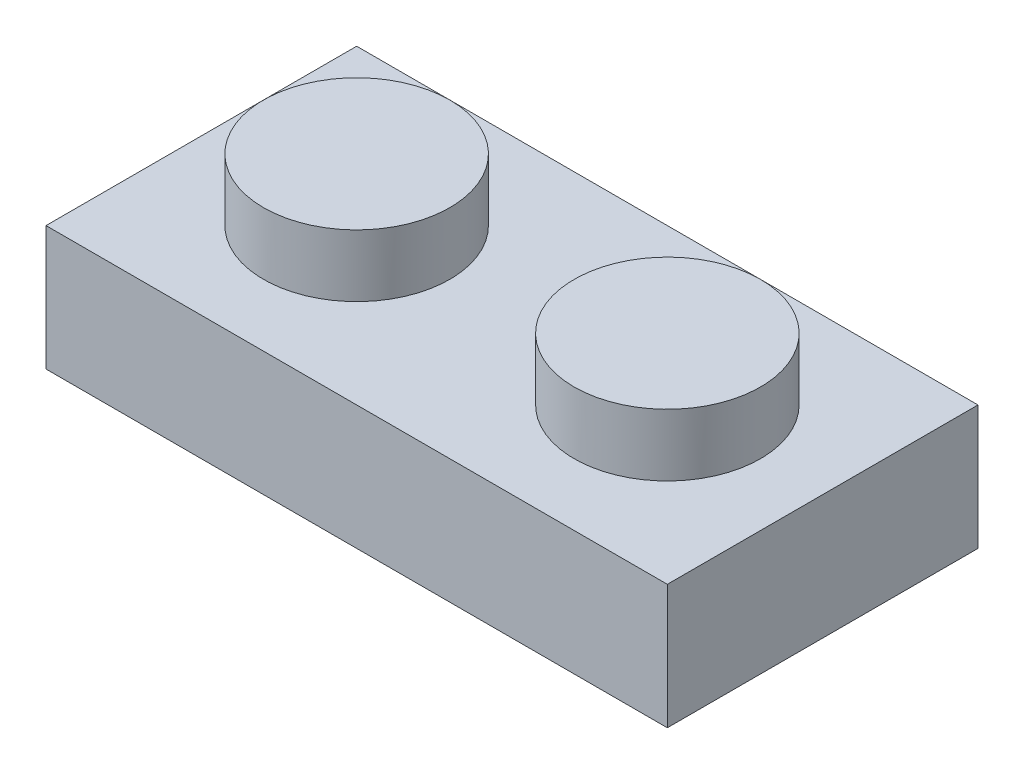
ISO-10303-21;
HEADER;
FILE_DESCRIPTION(('STEP AP214'),'2;1');
FILE_NAME('part.step','',(''),(''),'','','');
FILE_SCHEMA(('AUTOMOTIVE_DESIGN { 1 0 10303 214 1 1 1 1 }'));
ENDSEC;
DATA;
#1=APPLICATION_CONTEXT('core data for automotive mechanical design processes');
#2=APPLICATION_PROTOCOL_DEFINITION('international standard','automotive_design',2000,#1);
#3=PRODUCT_CONTEXT('',#1,'mechanical');
#4=PRODUCT('Part','Part','',(#3));
#5=PRODUCT_RELATED_PRODUCT_CATEGORY('part','',(#4));
#6=PRODUCT_DEFINITION_FORMATION('','',#4);
#7=PRODUCT_DEFINITION_CONTEXT('part definition',#1,'design');
#8=PRODUCT_DEFINITION('design','',#6,#7);
#9=PRODUCT_DEFINITION_SHAPE('','',#8);
#10=(LENGTH_UNIT() NAMED_UNIT(*) SI_UNIT(.MILLI.,.METRE.));
#11=(NAMED_UNIT(*) PLANE_ANGLE_UNIT() SI_UNIT($,.RADIAN.));
#12=(NAMED_UNIT(*) SI_UNIT($,.STERADIAN.) SOLID_ANGLE_UNIT());
#13=UNCERTAINTY_MEASURE_WITH_UNIT(LENGTH_MEASURE(1.E-05),#10,'distance_accuracy_value','');
#14=(GEOMETRIC_REPRESENTATION_CONTEXT(3) GLOBAL_UNCERTAINTY_ASSIGNED_CONTEXT((#13)) GLOBAL_UNIT_ASSIGNED_CONTEXT((#10,
#11,#12)) REPRESENTATION_CONTEXT('',''));
#15=CARTESIAN_POINT('',(0.,0.,0.));
#16=DIRECTION('',(0.,0.,1.));
#17=DIRECTION('',(1.,0.,0.));
#18=AXIS2_PLACEMENT_3D('',#15,#16,#17);
#19=CARTESIAN_POINT('',(0.,0.,0.));
#20=DIRECTION('',(0.,-1.,0.));
#21=DIRECTION('',(0.,0.,-1.));
#22=AXIS2_PLACEMENT_3D('',#19,#20,#21);
#23=PLANE('',#22);
#24=DIRECTION('',(0.,0.,1.));
#25=VECTOR('',#24,1.);
#26=CARTESIAN_POINT('',(0.,0.,0.));
#27=LINE('',#26,#25);
#28=CARTESIAN_POINT('',(0.,0.,-8.));
#29=VERTEX_POINT('',#28);
#30=CARTESIAN_POINT('',(0.,0.,0.));
#31=VERTEX_POINT('',#30);
#32=EDGE_CURVE('E190',#29,#31,#27,.T.);
#33=ORIENTED_EDGE('',*,*,#32,.F.);
#34=DIRECTION('',(-1.,0.,0.));
#35=VECTOR('',#34,1.);
#36=CARTESIAN_POINT('',(0.,0.,-8.));
#37=LINE('',#36,#35);
#38=CARTESIAN_POINT('',(16.,0.,-8.));
#39=VERTEX_POINT('',#38);
#40=EDGE_CURVE('E85',#39,#29,#37,.T.);
#41=ORIENTED_EDGE('',*,*,#40,.F.);
#42=DIRECTION('',(0.,0.,-1.));
#43=VECTOR('',#42,1.);
#44=CARTESIAN_POINT('',(16.,0.,0.));
#45=LINE('',#44,#43);
#46=CARTESIAN_POINT('',(16.,0.,0.));
#47=VERTEX_POINT('',#46);
#48=EDGE_CURVE('E208',#47,#39,#45,.T.);
#49=ORIENTED_EDGE('',*,*,#48,.F.);
#50=DIRECTION('',(1.,0.,0.));
#51=VECTOR('',#50,1.);
#52=CARTESIAN_POINT('',(0.,0.,0.));
#53=LINE('',#52,#51);
#54=EDGE_CURVE('E205',#31,#47,#53,.T.);
#55=ORIENTED_EDGE('',*,*,#54,.F.);
#56=EDGE_LOOP('',(#33,#41,#49,#55));
#57=FACE_BOUND('',#56,.T.);
#58=DIRECTION('',(-1.,0.,0.));
#59=VECTOR('',#58,1.);
#60=CARTESIAN_POINT('',(0.,0.,-6.4));
#61=LINE('',#60,#59);
#62=CARTESIAN_POINT('',(14.4,0.,-6.4));
#63=VERTEX_POINT('',#62);
#64=CARTESIAN_POINT('',(1.6,0.,-6.4));
#65=VERTEX_POINT('',#64);
#66=EDGE_CURVE('E135',#63,#65,#61,.T.);
#67=ORIENTED_EDGE('',*,*,#66,.T.);
#68=DIRECTION('',(0.,0.,1.));
#69=VECTOR('',#68,1.);
#70=CARTESIAN_POINT('',(1.6,0.,0.));
#71=LINE('',#70,#69);
#72=CARTESIAN_POINT('',(1.6,0.,-1.6));
#73=VERTEX_POINT('',#72);
#74=EDGE_CURVE('E169',#65,#73,#71,.T.);
#75=ORIENTED_EDGE('',*,*,#74,.T.);
#76=DIRECTION('',(1.,0.,0.));
#77=VECTOR('',#76,1.);
#78=CARTESIAN_POINT('',(0.,0.,-1.6));
#79=LINE('',#78,#77);
#80=CARTESIAN_POINT('',(14.4,0.,-1.6));
#81=VERTEX_POINT('',#80);
#82=EDGE_CURVE('E139',#73,#81,#79,.T.);
#83=ORIENTED_EDGE('',*,*,#82,.T.);
#84=DIRECTION('',(0.,0.,-1.));
#85=VECTOR('',#84,1.);
#86=CARTESIAN_POINT('',(14.4,0.,0.));
#87=LINE('',#86,#85);
#88=EDGE_CURVE('E55',#81,#63,#87,.T.);
#89=ORIENTED_EDGE('',*,*,#88,.T.);
#90=EDGE_LOOP('',(#67,#75,#83,#89));
#91=FACE_BOUND('',#90,.T.);
#92=ADVANCED_FACE('F39',(#57,#91),#23,.T.);
#93=CARTESIAN_POINT('',(0.,3.2,0.));
#94=DIRECTION('',(1.,0.,0.));
#95=DIRECTION('',(0.,0.,-1.));
#96=AXIS2_PLACEMENT_3D('',#93,#94,#95);
#97=PLANE('',#96);
#98=ORIENTED_EDGE('',*,*,#32,.T.);
#99=DIRECTION('',(0.,-1.,0.));
#100=VECTOR('',#99,1.);
#101=CARTESIAN_POINT('',(0.,3.2,0.));
#102=LINE('',#101,#100);
#103=CARTESIAN_POINT('',(0.,3.2,0.));
#104=VERTEX_POINT('',#103);
#105=EDGE_CURVE('E222',#104,#31,#102,.T.);
#106=ORIENTED_EDGE('',*,*,#105,.F.);
#107=DIRECTION('',(0.,0.,1.));
#108=VECTOR('',#107,1.);
#109=CARTESIAN_POINT('',(0.,3.2,0.));
#110=LINE('',#109,#108);
#111=CARTESIAN_POINT('',(0.,3.2,-8.));
#112=VERTEX_POINT('',#111);
#113=EDGE_CURVE('E191',#112,#104,#110,.T.);
#114=ORIENTED_EDGE('',*,*,#113,.F.);
#115=DIRECTION('',(0.,-1.,0.));
#116=VECTOR('',#115,1.);
#117=CARTESIAN_POINT('',(0.,3.2,-8.));
#118=LINE('',#117,#116);
#119=EDGE_CURVE('E201',#112,#29,#118,.T.);
#120=ORIENTED_EDGE('',*,*,#119,.T.);
#121=EDGE_LOOP('',(#98,#106,#114,#120));
#122=FACE_BOUND('',#121,.T.);
#123=ADVANCED_FACE('F41',(#122),#97,.F.);
#124=CARTESIAN_POINT('',(0.,3.2,0.));
#125=DIRECTION('',(0.,0.,-1.));
#126=DIRECTION('',(-1.,0.,0.));
#127=AXIS2_PLACEMENT_3D('',#124,#125,#126);
#128=PLANE('',#127);
#129=ORIENTED_EDGE('',*,*,#54,.T.);
#130=DIRECTION('',(0.,-1.,0.));
#131=VECTOR('',#130,1.);
#132=CARTESIAN_POINT('',(16.,3.2,0.));
#133=LINE('',#132,#131);
#134=CARTESIAN_POINT('',(16.,3.2,0.));
#135=VERTEX_POINT('',#134);
#136=EDGE_CURVE('E218',#135,#47,#133,.T.);
#137=ORIENTED_EDGE('',*,*,#136,.F.);
#138=DIRECTION('',(1.,0.,0.));
#139=VECTOR('',#138,1.);
#140=CARTESIAN_POINT('',(0.,3.2,0.));
#141=LINE('',#140,#139);
#142=EDGE_CURVE('E93',#104,#135,#141,.T.);
#143=ORIENTED_EDGE('',*,*,#142,.F.);
#144=ORIENTED_EDGE('',*,*,#105,.T.);
#145=EDGE_LOOP('',(#129,#137,#143,#144));
#146=FACE_BOUND('',#145,.T.);
#147=ADVANCED_FACE('F239',(#146),#128,.F.);
#148=CARTESIAN_POINT('',(16.,3.2,0.));
#149=DIRECTION('',(-1.,0.,0.));
#150=DIRECTION('',(0.,0.,1.));
#151=AXIS2_PLACEMENT_3D('',#148,#149,#150);
#152=PLANE('',#151);
#153=ORIENTED_EDGE('',*,*,#48,.T.);
#154=DIRECTION('',(0.,-1.,0.));
#155=VECTOR('',#154,1.);
#156=CARTESIAN_POINT('',(16.,3.2,-8.));
#157=LINE('',#156,#155);
#158=CARTESIAN_POINT('',(16.,3.2,-8.));
#159=VERTEX_POINT('',#158);
#160=EDGE_CURVE('E215',#159,#39,#157,.T.);
#161=ORIENTED_EDGE('',*,*,#160,.F.);
#162=DIRECTION('',(0.,0.,-1.));
#163=VECTOR('',#162,1.);
#164=CARTESIAN_POINT('',(16.,3.2,0.));
#165=LINE('',#164,#163);
#166=EDGE_CURVE('E196',#135,#159,#165,.T.);
#167=ORIENTED_EDGE('',*,*,#166,.F.);
#168=ORIENTED_EDGE('',*,*,#136,.T.);
#169=EDGE_LOOP('',(#153,#161,#167,#168));
#170=FACE_BOUND('',#169,.T.);
#171=ADVANCED_FACE('F244',(#170),#152,.F.);
#172=CARTESIAN_POINT('',(0.,3.2,-8.));
#173=DIRECTION('',(0.,0.,1.));
#174=DIRECTION('',(1.,0.,0.));
#175=AXIS2_PLACEMENT_3D('',#172,#173,#174);
#176=PLANE('',#175);
#177=ORIENTED_EDGE('',*,*,#40,.T.);
#178=ORIENTED_EDGE('',*,*,#119,.F.);
#179=DIRECTION('',(-1.,0.,0.));
#180=VECTOR('',#179,1.);
#181=CARTESIAN_POINT('',(0.,3.2,-8.));
#182=LINE('',#181,#180);
#183=EDGE_CURVE('E64',#159,#112,#182,.T.);
#184=ORIENTED_EDGE('',*,*,#183,.F.);
#185=ORIENTED_EDGE('',*,*,#160,.T.);
#186=EDGE_LOOP('',(#177,#178,#184,#185));
#187=FACE_BOUND('',#186,.T.);
#188=ADVANCED_FACE('F232',(#187),#176,.F.);
#189=CARTESIAN_POINT('',(0.,3.2,0.));
#190=DIRECTION('',(0.,-1.,0.));
#191=DIRECTION('',(0.,0.,-1.));
#192=AXIS2_PLACEMENT_3D('',#189,#190,#191);
#193=PLANE('',#192);
#194=CARTESIAN_POINT('',(4.,3.2,-4.));
#195=DIRECTION('',(0.,-1.,0.));
#196=DIRECTION('',(0.,0.,-1.));
#197=AXIS2_PLACEMENT_3D('',#194,#195,#196);
#198=CIRCLE('',#197,2.4);
#199=CARTESIAN_POINT('',(4.,3.2,-6.4));
#200=VERTEX_POINT('',#199);
#201=EDGE_CURVE('E11',#200,#200,#198,.F.);
#202=ORIENTED_EDGE('',*,*,#201,.F.);
#203=EDGE_LOOP('',(#202));
#204=FACE_BOUND('',#203,.T.);
#205=CARTESIAN_POINT('',(12.,3.2,-4.));
#206=DIRECTION('',(0.,-1.,0.));
#207=DIRECTION('',(0.,0.,-1.));
#208=AXIS2_PLACEMENT_3D('',#205,#206,#207);
#209=CIRCLE('',#208,2.4);
#210=CARTESIAN_POINT('',(12.,3.2,-6.4));
#211=VERTEX_POINT('',#210);
#212=EDGE_CURVE('E48',#211,#211,#209,.F.);
#213=ORIENTED_EDGE('',*,*,#212,.F.);
#214=EDGE_LOOP('',(#213));
#215=FACE_BOUND('',#214,.T.);
#216=ORIENTED_EDGE('',*,*,#113,.T.);
#217=ORIENTED_EDGE('',*,*,#142,.T.);
#218=ORIENTED_EDGE('',*,*,#166,.T.);
#219=ORIENTED_EDGE('',*,*,#183,.T.);
#220=EDGE_LOOP('',(#216,#217,#218,#219));
#221=FACE_BOUND('',#220,.T.);
#222=ADVANCED_FACE('F230',(#204,#215,#221),#193,.F.);
#223=CARTESIAN_POINT('',(12.,4.8,-4.));
#224=DIRECTION('',(0.,-1.,0.));
#225=DIRECTION('',(0.,0.,-1.));
#226=AXIS2_PLACEMENT_3D('',#223,#224,#225);
#227=CYLINDRICAL_SURFACE('',#226,2.4);
#228=CARTESIAN_POINT('',(12.,4.8,-4.));
#229=DIRECTION('',(0.,1.,0.));
#230=DIRECTION('',(0.,0.,1.));
#231=AXIS2_PLACEMENT_3D('',#228,#229,#230);
#232=CIRCLE('',#231,2.4);
#233=CARTESIAN_POINT('',(12.,4.8,-1.6));
#234=VERTEX_POINT('',#233);
#235=EDGE_CURVE('E186',#234,#234,#232,.T.);
#236=ORIENTED_EDGE('',*,*,#235,.F.);
#237=EDGE_LOOP('',(#236));
#238=FACE_BOUND('',#237,.T.);
#239=ORIENTED_EDGE('',*,*,#212,.T.);
#240=EDGE_LOOP('',(#239));
#241=FACE_BOUND('',#240,.T.);
#242=ADVANCED_FACE('F228',(#238,#241),#227,.T.);
#243=CARTESIAN_POINT('',(12.,4.8,-4.));
#244=DIRECTION('',(0.,1.,0.));
#245=DIRECTION('',(0.,0.,1.));
#246=AXIS2_PLACEMENT_3D('',#243,#244,#245);
#247=PLANE('',#246);
#248=ORIENTED_EDGE('',*,*,#235,.T.);
#249=EDGE_LOOP('',(#248));
#250=FACE_BOUND('',#249,.T.);
#251=ADVANCED_FACE('F290',(#250),#247,.T.);
#252=CARTESIAN_POINT('',(4.,4.8,-4.));
#253=DIRECTION('',(0.,-1.,0.));
#254=DIRECTION('',(0.,0.,-1.));
#255=AXIS2_PLACEMENT_3D('',#252,#253,#254);
#256=CYLINDRICAL_SURFACE('',#255,2.4);
#257=CARTESIAN_POINT('',(4.,4.8,-4.));
#258=DIRECTION('',(0.,1.,0.));
#259=DIRECTION('',(0.,0.,1.));
#260=AXIS2_PLACEMENT_3D('',#257,#258,#259);
#261=CIRCLE('',#260,2.4);
#262=CARTESIAN_POINT('',(4.,4.8,-1.6));
#263=VERTEX_POINT('',#262);
#264=EDGE_CURVE('E163',#263,#263,#261,.T.);
#265=ORIENTED_EDGE('',*,*,#264,.F.);
#266=EDGE_LOOP('',(#265));
#267=FACE_BOUND('',#266,.T.);
#268=ORIENTED_EDGE('',*,*,#201,.T.);
#269=EDGE_LOOP('',(#268));
#270=FACE_BOUND('',#269,.T.);
#271=ADVANCED_FACE('F286',(#267,#270),#256,.T.);
#272=CARTESIAN_POINT('',(4.,4.8,-4.));
#273=DIRECTION('',(0.,1.,0.));
#274=DIRECTION('',(0.,0.,1.));
#275=AXIS2_PLACEMENT_3D('',#272,#273,#274);
#276=PLANE('',#275);
#277=ORIENTED_EDGE('',*,*,#264,.T.);
#278=EDGE_LOOP('',(#277));
#279=FACE_BOUND('',#278,.T.);
#280=ADVANCED_FACE('F283',(#279),#276,.T.);
#281=CARTESIAN_POINT('',(1.6,3.2,0.));
#282=DIRECTION('',(1.,0.,0.));
#283=DIRECTION('',(0.,0.,-1.));
#284=AXIS2_PLACEMENT_3D('',#281,#282,#283);
#285=PLANE('',#284);
#286=ORIENTED_EDGE('',*,*,#74,.F.);
#287=DIRECTION('',(0.,-1.,0.));
#288=VECTOR('',#287,1.);
#289=CARTESIAN_POINT('',(1.6,3.2,-6.4));
#290=LINE('',#289,#288);
#291=CARTESIAN_POINT('',(1.6,1.6,-6.4));
#292=VERTEX_POINT('',#291);
#293=EDGE_CURVE('E133',#292,#65,#290,.T.);
#294=ORIENTED_EDGE('',*,*,#293,.F.);
#295=DIRECTION('',(0.,0.,1.));
#296=VECTOR('',#295,1.);
#297=CARTESIAN_POINT('',(1.6,1.6,0.));
#298=LINE('',#297,#296);
#299=CARTESIAN_POINT('',(1.6,1.6,-1.6));
#300=VERTEX_POINT('',#299);
#301=EDGE_CURVE('E120',#292,#300,#298,.T.);
#302=ORIENTED_EDGE('',*,*,#301,.T.);
#303=DIRECTION('',(0.,-1.,0.));
#304=VECTOR('',#303,1.);
#305=CARTESIAN_POINT('',(1.6,3.2,-1.6));
#306=LINE('',#305,#304);
#307=EDGE_CURVE('E131',#300,#73,#306,.T.);
#308=ORIENTED_EDGE('',*,*,#307,.T.);
#309=EDGE_LOOP('',(#286,#294,#302,#308));
#310=FACE_BOUND('',#309,.T.);
#311=ADVANCED_FACE('F130',(#310),#285,.T.);
#312=CARTESIAN_POINT('',(0.,3.2,-1.6));
#313=DIRECTION('',(0.,0.,-1.));
#314=DIRECTION('',(-1.,0.,0.));
#315=AXIS2_PLACEMENT_3D('',#312,#313,#314);
#316=PLANE('',#315);
#317=ORIENTED_EDGE('',*,*,#82,.F.);
#318=ORIENTED_EDGE('',*,*,#307,.F.);
#319=DIRECTION('',(1.,0.,0.));
#320=VECTOR('',#319,1.);
#321=CARTESIAN_POINT('',(0.,1.6,-1.6));
#322=LINE('',#321,#320);
#323=CARTESIAN_POINT('',(14.4,1.6,-1.6));
#324=VERTEX_POINT('',#323);
#325=EDGE_CURVE('E116',#300,#324,#322,.T.);
#326=ORIENTED_EDGE('',*,*,#325,.T.);
#327=DIRECTION('',(0.,-1.,0.));
#328=VECTOR('',#327,1.);
#329=CARTESIAN_POINT('',(14.4,3.2,-1.6));
#330=LINE('',#329,#328);
#331=EDGE_CURVE('E142',#324,#81,#330,.T.);
#332=ORIENTED_EDGE('',*,*,#331,.T.);
#333=EDGE_LOOP('',(#317,#318,#326,#332));
#334=FACE_BOUND('',#333,.T.);
#335=ADVANCED_FACE('F137',(#334),#316,.T.);
#336=CARTESIAN_POINT('',(14.4,3.2,0.));
#337=DIRECTION('',(-1.,0.,0.));
#338=DIRECTION('',(0.,0.,1.));
#339=AXIS2_PLACEMENT_3D('',#336,#337,#338);
#340=PLANE('',#339);
#341=ORIENTED_EDGE('',*,*,#88,.F.);
#342=ORIENTED_EDGE('',*,*,#331,.F.);
#343=DIRECTION('',(0.,0.,-1.));
#344=VECTOR('',#343,1.);
#345=CARTESIAN_POINT('',(14.4,1.6,0.));
#346=LINE('',#345,#344);
#347=CARTESIAN_POINT('',(14.4,1.6,-6.4));
#348=VERTEX_POINT('',#347);
#349=EDGE_CURVE('E121',#324,#348,#346,.T.);
#350=ORIENTED_EDGE('',*,*,#349,.T.);
#351=DIRECTION('',(0.,-1.,0.));
#352=VECTOR('',#351,1.);
#353=CARTESIAN_POINT('',(14.4,3.2,-6.4));
#354=LINE('',#353,#352);
#355=EDGE_CURVE('E149',#348,#63,#354,.T.);
#356=ORIENTED_EDGE('',*,*,#355,.T.);
#357=EDGE_LOOP('',(#341,#342,#350,#356));
#358=FACE_BOUND('',#357,.T.);
#359=ADVANCED_FACE('F253',(#358),#340,.T.);
#360=CARTESIAN_POINT('',(0.,3.2,-6.4));
#361=DIRECTION('',(0.,0.,1.));
#362=DIRECTION('',(1.,0.,0.));
#363=AXIS2_PLACEMENT_3D('',#360,#361,#362);
#364=PLANE('',#363);
#365=ORIENTED_EDGE('',*,*,#66,.F.);
#366=ORIENTED_EDGE('',*,*,#355,.F.);
#367=DIRECTION('',(-1.,0.,0.));
#368=VECTOR('',#367,1.);
#369=CARTESIAN_POINT('',(0.,1.6,-6.4));
#370=LINE('',#369,#368);
#371=EDGE_CURVE('E153',#348,#292,#370,.T.);
#372=ORIENTED_EDGE('',*,*,#371,.T.);
#373=ORIENTED_EDGE('',*,*,#293,.T.);
#374=EDGE_LOOP('',(#365,#366,#372,#373));
#375=FACE_BOUND('',#374,.T.);
#376=ADVANCED_FACE('F252',(#375),#364,.T.);
#377=CARTESIAN_POINT('',(0.,1.6,0.));
#378=DIRECTION('',(0.,-1.,0.));
#379=DIRECTION('',(0.,0.,-1.));
#380=AXIS2_PLACEMENT_3D('',#377,#378,#379);
#381=PLANE('',#380);
#382=CARTESIAN_POINT('',(4.,1.6,-4.));
#383=DIRECTION('',(0.,-1.,0.));
#384=DIRECTION('',(0.,0.,-1.));
#385=AXIS2_PLACEMENT_3D('',#382,#383,#384);
#386=CIRCLE('',#385,0.799999999999999);
#387=CARTESIAN_POINT('',(4.,1.6,-4.8));
#388=VERTEX_POINT('',#387);
#389=EDGE_CURVE('E147',#388,#388,#386,.F.);
#390=ORIENTED_EDGE('',*,*,#389,.T.);
#391=EDGE_LOOP('',(#390));
#392=FACE_BOUND('',#391,.T.);
#393=CARTESIAN_POINT('',(12.,1.6,-4.));
#394=DIRECTION('',(0.,-1.,0.));
#395=DIRECTION('',(0.,0.,-1.));
#396=AXIS2_PLACEMENT_3D('',#393,#394,#395);
#397=CIRCLE('',#396,0.799999999999999);
#398=CARTESIAN_POINT('',(12.,1.6,-4.8));
#399=VERTEX_POINT('',#398);
#400=EDGE_CURVE('E141',#399,#399,#397,.F.);
#401=ORIENTED_EDGE('',*,*,#400,.T.);
#402=EDGE_LOOP('',(#401));
#403=FACE_BOUND('',#402,.T.);
#404=ORIENTED_EDGE('',*,*,#301,.F.);
#405=ORIENTED_EDGE('',*,*,#371,.F.);
#406=ORIENTED_EDGE('',*,*,#349,.F.);
#407=ORIENTED_EDGE('',*,*,#325,.F.);
#408=EDGE_LOOP('',(#404,#405,#406,#407));
#409=FACE_BOUND('',#408,.T.);
#410=ADVANCED_FACE('F118',(#392,#403,#409),#381,.T.);
#411=CARTESIAN_POINT('',(12.,4.8,-4.));
#412=DIRECTION('',(0.,-1.,0.));
#413=DIRECTION('',(0.,0.,-1.));
#414=AXIS2_PLACEMENT_3D('',#411,#412,#413);
#415=CYLINDRICAL_SURFACE('',#414,0.799999999999999);
#416=CARTESIAN_POINT('',(12.,3.2,-4.));
#417=DIRECTION('',(0.,1.,0.));
#418=DIRECTION('',(0.,0.,1.));
#419=AXIS2_PLACEMENT_3D('',#416,#417,#418);
#420=CIRCLE('',#419,0.799999999999999);
#421=CARTESIAN_POINT('',(12.,3.2,-3.2));
#422=VERTEX_POINT('',#421);
#423=EDGE_CURVE('E165',#422,#422,#420,.T.);
#424=ORIENTED_EDGE('',*,*,#423,.T.);
#425=EDGE_LOOP('',(#424));
#426=FACE_BOUND('',#425,.T.);
#427=ORIENTED_EDGE('',*,*,#400,.F.);
#428=EDGE_LOOP('',(#427));
#429=FACE_BOUND('',#428,.T.);
#430=ADVANCED_FACE('F266',(#426,#429),#415,.F.);
#431=CARTESIAN_POINT('',(12.,3.2,-4.));
#432=DIRECTION('',(0.,1.,0.));
#433=DIRECTION('',(0.,0.,1.));
#434=AXIS2_PLACEMENT_3D('',#431,#432,#433);
#435=PLANE('',#434);
#436=ORIENTED_EDGE('',*,*,#423,.F.);
#437=EDGE_LOOP('',(#436));
#438=FACE_BOUND('',#437,.T.);
#439=ADVANCED_FACE('F270',(#438),#435,.F.);
#440=CARTESIAN_POINT('',(4.,4.8,-4.));
#441=DIRECTION('',(0.,-1.,0.));
#442=DIRECTION('',(0.,0.,-1.));
#443=AXIS2_PLACEMENT_3D('',#440,#441,#442);
#444=CYLINDRICAL_SURFACE('',#443,0.799999999999999);
#445=CARTESIAN_POINT('',(4.,3.2,-4.));
#446=DIRECTION('',(0.,1.,0.));
#447=DIRECTION('',(0.,0.,1.));
#448=AXIS2_PLACEMENT_3D('',#445,#446,#447);
#449=CIRCLE('',#448,0.799999999999999);
#450=CARTESIAN_POINT('',(4.,3.2,-3.2));
#451=VERTEX_POINT('',#450);
#452=EDGE_CURVE('E170',#451,#451,#449,.T.);
#453=ORIENTED_EDGE('',*,*,#452,.T.);
#454=EDGE_LOOP('',(#453));
#455=FACE_BOUND('',#454,.T.);
#456=ORIENTED_EDGE('',*,*,#389,.F.);
#457=EDGE_LOOP('',(#456));
#458=FACE_BOUND('',#457,.T.);
#459=ADVANCED_FACE('F274',(#455,#458),#444,.F.);
#460=CARTESIAN_POINT('',(4.,3.2,-4.));
#461=DIRECTION('',(0.,1.,0.));
#462=DIRECTION('',(0.,0.,1.));
#463=AXIS2_PLACEMENT_3D('',#460,#461,#462);
#464=PLANE('',#463);
#465=ORIENTED_EDGE('',*,*,#452,.F.);
#466=EDGE_LOOP('',(#465));
#467=FACE_BOUND('',#466,.T.);
#468=ADVANCED_FACE('F278',(#467),#464,.F.);
#469=CLOSED_SHELL('',(#92,#123,#147,#171,#188,#222,#242,#251,#271,#280,#311,#335,#359,#376,#410,
#430,#439,#459,#468));
#470=MANIFOLD_SOLID_BREP('B2',#469);
#471=ADVANCED_BREP_SHAPE_REPRESENTATION('',(#18,#470),#14);
#472=SHAPE_DEFINITION_REPRESENTATION(#9,#471);
ENDSEC;
END-ISO-10303-21;
